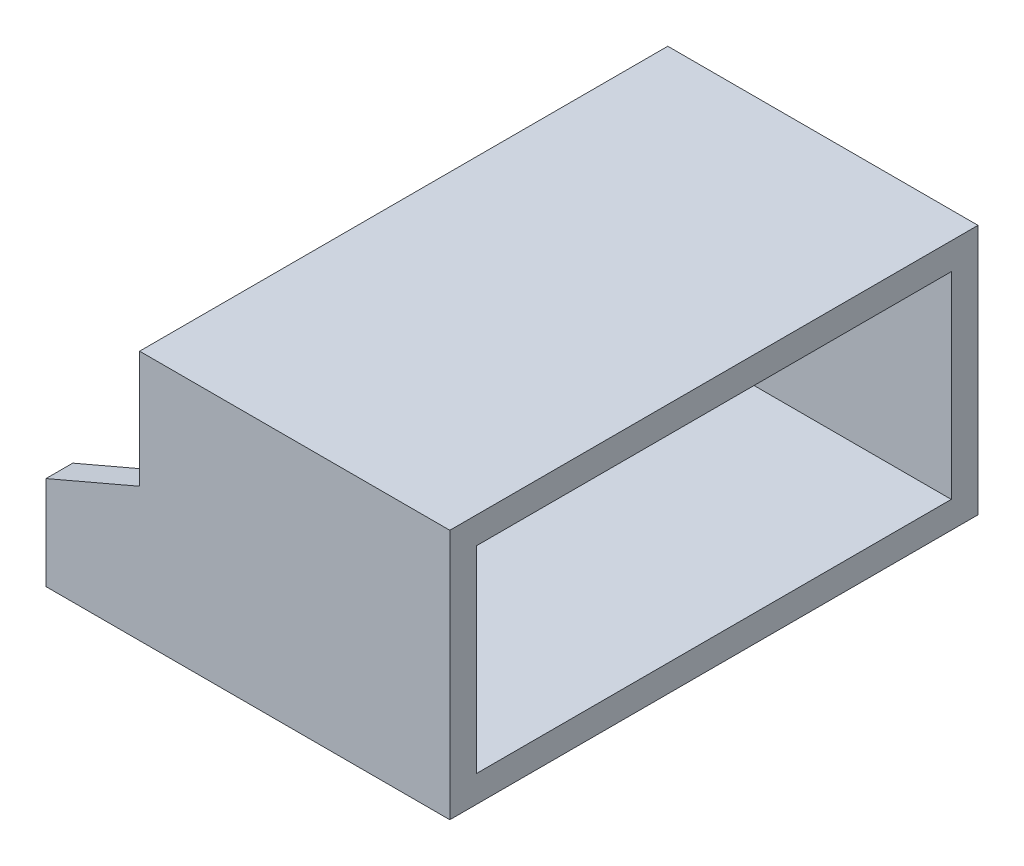
ISO-10303-21;
HEADER;
FILE_DESCRIPTION(('STEP AP214'),'2;1');
FILE_NAME('part.step','',(''),(''),'','','');
FILE_SCHEMA(('AUTOMOTIVE_DESIGN { 1 0 10303 214 1 1 1 1 }'));
ENDSEC;
DATA;
#1=APPLICATION_CONTEXT('core data for automotive mechanical design processes');
#2=APPLICATION_PROTOCOL_DEFINITION('international standard','automotive_design',2000,#1);
#3=PRODUCT_CONTEXT('',#1,'mechanical');
#4=PRODUCT('Part','Part','',(#3));
#5=PRODUCT_RELATED_PRODUCT_CATEGORY('part','',(#4));
#6=PRODUCT_DEFINITION_FORMATION('','',#4);
#7=PRODUCT_DEFINITION_CONTEXT('part definition',#1,'design');
#8=PRODUCT_DEFINITION('design','',#6,#7);
#9=PRODUCT_DEFINITION_SHAPE('','',#8);
#10=(LENGTH_UNIT() NAMED_UNIT(*) SI_UNIT(.MILLI.,.METRE.));
#11=(NAMED_UNIT(*) PLANE_ANGLE_UNIT() SI_UNIT($,.RADIAN.));
#12=(NAMED_UNIT(*) SI_UNIT($,.STERADIAN.) SOLID_ANGLE_UNIT());
#13=UNCERTAINTY_MEASURE_WITH_UNIT(LENGTH_MEASURE(1.E-05),#10,'distance_accuracy_value','');
#14=(GEOMETRIC_REPRESENTATION_CONTEXT(3) GLOBAL_UNCERTAINTY_ASSIGNED_CONTEXT((#13)) GLOBAL_UNIT_ASSIGNED_CONTEXT((#10,
#11,#12)) REPRESENTATION_CONTEXT('',''));
#15=CARTESIAN_POINT('',(0.,0.,0.));
#16=DIRECTION('',(0.,0.,1.));
#17=DIRECTION('',(1.,0.,0.));
#18=AXIS2_PLACEMENT_3D('',#15,#16,#17);
#19=CARTESIAN_POINT('',(5.8928,4.7625,0.));
#20=DIRECTION('',(-1.,0.,0.));
#21=DIRECTION('',(0.,0.,1.));
#22=AXIS2_PLACEMENT_3D('',#19,#20,#21);
#23=PLANE('',#22);
#24=DIRECTION('',(0.,0.,-1.));
#25=VECTOR('',#24,1.);
#26=CARTESIAN_POINT('',(5.8928,0.,0.));
#27=LINE('',#26,#25);
#28=CARTESIAN_POINT('',(5.8928,0.,0.));
#29=VERTEX_POINT('',#28);
#30=CARTESIAN_POINT('',(5.8928,0.,-10.033));
#31=VERTEX_POINT('',#30);
#32=EDGE_CURVE('E285',#29,#31,#27,.T.);
#33=ORIENTED_EDGE('',*,*,#32,.T.);
#34=DIRECTION('',(0.,-1.,0.));
#35=VECTOR('',#34,1.);
#36=CARTESIAN_POINT('',(5.8928,4.7625,-10.033));
#37=LINE('',#36,#35);
#38=CARTESIAN_POINT('',(5.8928,4.7625,-10.033));
#39=VERTEX_POINT('',#38);
#40=EDGE_CURVE('E292',#39,#31,#37,.T.);
#41=ORIENTED_EDGE('',*,*,#40,.F.);
#42=DIRECTION('',(0.,0.,-1.));
#43=VECTOR('',#42,1.);
#44=CARTESIAN_POINT('',(5.8928,4.7625,0.));
#45=LINE('',#44,#43);
#46=CARTESIAN_POINT('',(5.8928,4.7625,0.));
#47=VERTEX_POINT('',#46);
#48=EDGE_CURVE('E277',#47,#39,#45,.T.);
#49=ORIENTED_EDGE('',*,*,#48,.F.);
#50=DIRECTION('',(0.,-1.,0.));
#51=VECTOR('',#50,1.);
#52=CARTESIAN_POINT('',(5.8928,4.7625,0.));
#53=LINE('',#52,#51);
#54=EDGE_CURVE('E54',#47,#29,#53,.T.);
#55=ORIENTED_EDGE('',*,*,#54,.T.);
#56=EDGE_LOOP('',(#33,#41,#49,#55));
#57=FACE_BOUND('',#56,.T.);
#58=DIRECTION('',(0.,0.,-1.));
#59=VECTOR('',#58,1.);
#60=CARTESIAN_POINT('',(5.8928,0.508,0.));
#61=LINE('',#60,#59);
#62=CARTESIAN_POINT('',(5.8928,0.508,-0.508));
#63=VERTEX_POINT('',#62);
#64=CARTESIAN_POINT('',(5.8928,0.508,-9.525));
#65=VERTEX_POINT('',#64);
#66=EDGE_CURVE('E249',#63,#65,#61,.T.);
#67=ORIENTED_EDGE('',*,*,#66,.F.);
#68=DIRECTION('',(0.,-1.,0.));
#69=VECTOR('',#68,1.);
#70=CARTESIAN_POINT('',(5.8928,4.7625,-0.508));
#71=LINE('',#70,#69);
#72=CARTESIAN_POINT('',(5.8928,4.2545,-0.508));
#73=VERTEX_POINT('',#72);
#74=EDGE_CURVE('E234',#73,#63,#71,.T.);
#75=ORIENTED_EDGE('',*,*,#74,.F.);
#76=DIRECTION('',(0.,0.,-1.));
#77=VECTOR('',#76,1.);
#78=CARTESIAN_POINT('',(5.8928,4.2545,0.));
#79=LINE('',#78,#77);
#80=CARTESIAN_POINT('',(5.8928,4.2545,-9.525));
#81=VERTEX_POINT('',#80);
#82=EDGE_CURVE('E253',#73,#81,#79,.T.);
#83=ORIENTED_EDGE('',*,*,#82,.T.);
#84=DIRECTION('',(0.,-1.,0.));
#85=VECTOR('',#84,1.);
#86=CARTESIAN_POINT('',(5.8928,4.7625,-9.525));
#87=LINE('',#86,#85);
#88=EDGE_CURVE('E245',#81,#65,#87,.T.);
#89=ORIENTED_EDGE('',*,*,#88,.T.);
#90=EDGE_LOOP('',(#67,#75,#83,#89));
#91=FACE_BOUND('',#90,.T.);
#92=ADVANCED_FACE('F45',(#57,#91),#23,.F.);
#93=CARTESIAN_POINT('',(0.,4.7625,0.));
#94=DIRECTION('',(1.,0.,0.));
#95=DIRECTION('',(0.,0.,-1.));
#96=AXIS2_PLACEMENT_3D('',#93,#94,#95);
#97=PLANE('',#96);
#98=DIRECTION('',(0.,-1.,0.));
#99=VECTOR('',#98,1.);
#100=CARTESIAN_POINT('',(0.,4.7625,-10.033));
#101=LINE('',#100,#99);
#102=CARTESIAN_POINT('',(0.,4.7625,-10.033));
#103=VERTEX_POINT('',#102);
#104=CARTESIAN_POINT('',(0.,2.54,-10.033));
#105=VERTEX_POINT('',#104);
#106=EDGE_CURVE('E66',#103,#105,#101,.T.);
#107=ORIENTED_EDGE('',*,*,#106,.T.);
#108=DIRECTION('',(0.,0.,-1.));
#109=VECTOR('',#108,1.);
#110=CARTESIAN_POINT('',(0.,2.54,-9.525));
#111=LINE('',#110,#109);
#112=CARTESIAN_POINT('',(0.,2.54,-9.525));
#113=VERTEX_POINT('',#112);
#114=EDGE_CURVE('E61',#113,#105,#111,.T.);
#115=ORIENTED_EDGE('',*,*,#114,.F.);
#116=DIRECTION('',(0.,-1.,0.));
#117=VECTOR('',#116,1.);
#118=CARTESIAN_POINT('',(0.,0.,-9.525));
#119=LINE('',#118,#117);
#120=CARTESIAN_POINT('',(0.,0.,-9.525));
#121=VERTEX_POINT('',#120);
#122=EDGE_CURVE('E160',#113,#121,#119,.T.);
#123=ORIENTED_EDGE('',*,*,#122,.T.);
#124=DIRECTION('',(0.,0.,1.));
#125=VECTOR('',#124,1.);
#126=CARTESIAN_POINT('',(0.,0.,0.));
#127=LINE('',#126,#125);
#128=CARTESIAN_POINT('',(0.,0.,-0.508));
#129=VERTEX_POINT('',#128);
#130=EDGE_CURVE('E147',#121,#129,#127,.T.);
#131=ORIENTED_EDGE('',*,*,#130,.T.);
#132=DIRECTION('',(0.,1.,0.));
#133=VECTOR('',#132,1.);
#134=CARTESIAN_POINT('',(0.,0.,-0.508));
#135=LINE('',#134,#133);
#136=CARTESIAN_POINT('',(0.,2.54,-0.508));
#137=VERTEX_POINT('',#136);
#138=EDGE_CURVE('E195',#129,#137,#135,.T.);
#139=ORIENTED_EDGE('',*,*,#138,.T.);
#140=DIRECTION('',(0.,0.,1.));
#141=VECTOR('',#140,1.);
#142=CARTESIAN_POINT('',(0.,2.54,-0.508));
#143=LINE('',#142,#141);
#144=CARTESIAN_POINT('',(0.,2.54,0.));
#145=VERTEX_POINT('',#144);
#146=EDGE_CURVE('E209',#137,#145,#143,.T.);
#147=ORIENTED_EDGE('',*,*,#146,.T.);
#148=DIRECTION('',(0.,-1.,0.));
#149=VECTOR('',#148,1.);
#150=CARTESIAN_POINT('',(0.,4.7625,0.));
#151=LINE('',#150,#149);
#152=CARTESIAN_POINT('',(0.,4.7625,0.));
#153=VERTEX_POINT('',#152);
#154=EDGE_CURVE('E11',#153,#145,#151,.T.);
#155=ORIENTED_EDGE('',*,*,#154,.F.);
#156=DIRECTION('',(0.,0.,1.));
#157=VECTOR('',#156,1.);
#158=CARTESIAN_POINT('',(0.,4.7625,0.));
#159=LINE('',#158,#157);
#160=EDGE_CURVE('E269',#103,#153,#159,.T.);
#161=ORIENTED_EDGE('',*,*,#160,.F.);
#162=EDGE_LOOP('',(#107,#115,#123,#131,#139,#147,#155,#161));
#163=FACE_BOUND('',#162,.T.);
#164=ADVANCED_FACE('F47',(#163),#97,.F.);
#165=CARTESIAN_POINT('',(0.,4.7625,0.));
#166=DIRECTION('',(0.,0.,-1.));
#167=DIRECTION('',(-1.,0.,0.));
#168=AXIS2_PLACEMENT_3D('',#165,#166,#167);
#169=PLANE('',#168);
#170=DIRECTION('',(1.,0.,0.));
#171=VECTOR('',#170,1.);
#172=CARTESIAN_POINT('',(0.,0.,0.));
#173=LINE('',#172,#171);
#174=CARTESIAN_POINT('',(-1.778,0.,0.));
#175=VERTEX_POINT('',#174);
#176=EDGE_CURVE('E157',#175,#29,#173,.T.);
#177=ORIENTED_EDGE('',*,*,#176,.T.);
#178=ORIENTED_EDGE('',*,*,#54,.F.);
#179=DIRECTION('',(1.,0.,0.));
#180=VECTOR('',#179,1.);
#181=CARTESIAN_POINT('',(0.,4.7625,0.));
#182=LINE('',#181,#180);
#183=EDGE_CURVE('E273',#153,#47,#182,.T.);
#184=ORIENTED_EDGE('',*,*,#183,.F.);
#185=ORIENTED_EDGE('',*,*,#154,.T.);
#186=DIRECTION('',(-0.919145030018058,-0.393919298579168,0.));
#187=VECTOR('',#186,1.);
#188=CARTESIAN_POINT('',(-1.778,1.778,0.));
#189=LINE('',#188,#187);
#190=CARTESIAN_POINT('',(-1.778,1.778,0.));
#191=VERTEX_POINT('',#190);
#192=EDGE_CURVE('E189',#145,#191,#189,.T.);
#193=ORIENTED_EDGE('',*,*,#192,.T.);
#194=DIRECTION('',(0.,-1.,0.));
#195=VECTOR('',#194,1.);
#196=CARTESIAN_POINT('',(-1.778,0.,0.));
#197=LINE('',#196,#195);
#198=EDGE_CURVE('E199',#191,#175,#197,.T.);
#199=ORIENTED_EDGE('',*,*,#198,.T.);
#200=EDGE_LOOP('',(#177,#178,#184,#185,#193,#199));
#201=FACE_BOUND('',#200,.T.);
#202=ADVANCED_FACE('F312',(#201),#169,.F.);
#203=CARTESIAN_POINT('',(0.,4.7625,-10.033));
#204=DIRECTION('',(0.,0.,1.));
#205=DIRECTION('',(1.,0.,0.));
#206=AXIS2_PLACEMENT_3D('',#203,#204,#205);
#207=PLANE('',#206);
#208=DIRECTION('',(-1.,0.,0.));
#209=VECTOR('',#208,1.);
#210=CARTESIAN_POINT('',(0.,0.,-10.033));
#211=LINE('',#210,#209);
#212=CARTESIAN_POINT('',(-1.778,0.,-10.033));
#213=VERTEX_POINT('',#212);
#214=EDGE_CURVE('E274',#31,#213,#211,.T.);
#215=ORIENTED_EDGE('',*,*,#214,.T.);
#216=DIRECTION('',(0.,1.,0.));
#217=VECTOR('',#216,1.);
#218=CARTESIAN_POINT('',(-1.778,0.,-10.033));
#219=LINE('',#218,#217);
#220=CARTESIAN_POINT('',(-1.778,1.778,-10.033));
#221=VERTEX_POINT('',#220);
#222=EDGE_CURVE('E180',#213,#221,#219,.T.);
#223=ORIENTED_EDGE('',*,*,#222,.T.);
#224=DIRECTION('',(0.919145030018058,0.393919298579168,0.));
#225=VECTOR('',#224,1.);
#226=CARTESIAN_POINT('',(0.,2.54,-10.033));
#227=LINE('',#226,#225);
#228=EDGE_CURVE('E165',#221,#105,#227,.T.);
#229=ORIENTED_EDGE('',*,*,#228,.T.);
#230=ORIENTED_EDGE('',*,*,#106,.F.);
#231=DIRECTION('',(-1.,0.,0.));
#232=VECTOR('',#231,1.);
#233=CARTESIAN_POINT('',(0.,4.7625,-10.033));
#234=LINE('',#233,#232);
#235=EDGE_CURVE('E280',#39,#103,#234,.T.);
#236=ORIENTED_EDGE('',*,*,#235,.F.);
#237=ORIENTED_EDGE('',*,*,#40,.T.);
#238=EDGE_LOOP('',(#215,#223,#229,#230,#236,#237));
#239=FACE_BOUND('',#238,.T.);
#240=ADVANCED_FACE('F307',(#239),#207,.F.);
#241=CARTESIAN_POINT('',(0.,4.7625,0.));
#242=DIRECTION('',(0.,-1.,0.));
#243=DIRECTION('',(0.,0.,-1.));
#244=AXIS2_PLACEMENT_3D('',#241,#242,#243);
#245=PLANE('',#244);
#246=ORIENTED_EDGE('',*,*,#160,.T.);
#247=ORIENTED_EDGE('',*,*,#183,.T.);
#248=ORIENTED_EDGE('',*,*,#48,.T.);
#249=ORIENTED_EDGE('',*,*,#235,.T.);
#250=EDGE_LOOP('',(#246,#247,#248,#249));
#251=FACE_BOUND('',#250,.T.);
#252=ADVANCED_FACE('F310',(#251),#245,.F.);
#253=CARTESIAN_POINT('',(0.,0.,0.));
#254=DIRECTION('',(0.,-1.,0.));
#255=DIRECTION('',(0.,0.,-1.));
#256=AXIS2_PLACEMENT_3D('',#253,#254,#255);
#257=PLANE('',#256);
#258=ORIENTED_EDGE('',*,*,#130,.F.);
#259=DIRECTION('',(-1.,0.,0.));
#260=VECTOR('',#259,1.);
#261=CARTESIAN_POINT('',(0.,0.,-9.525));
#262=LINE('',#261,#260);
#263=CARTESIAN_POINT('',(-1.778,0.,-9.525));
#264=VERTEX_POINT('',#263);
#265=EDGE_CURVE('E151',#121,#264,#262,.T.);
#266=ORIENTED_EDGE('',*,*,#265,.T.);
#267=DIRECTION('',(0.,0.,-1.));
#268=VECTOR('',#267,1.);
#269=CARTESIAN_POINT('',(-1.778,0.,-9.525));
#270=LINE('',#269,#268);
#271=EDGE_CURVE('E179',#264,#213,#270,.T.);
#272=ORIENTED_EDGE('',*,*,#271,.T.);
#273=ORIENTED_EDGE('',*,*,#214,.F.);
#274=ORIENTED_EDGE('',*,*,#32,.F.);
#275=ORIENTED_EDGE('',*,*,#176,.F.);
#276=DIRECTION('',(0.,0.,1.));
#277=VECTOR('',#276,1.);
#278=CARTESIAN_POINT('',(-1.778,0.,-0.508));
#279=LINE('',#278,#277);
#280=CARTESIAN_POINT('',(-1.778,0.,-0.508));
#281=VERTEX_POINT('',#280);
#282=EDGE_CURVE('E216',#281,#175,#279,.T.);
#283=ORIENTED_EDGE('',*,*,#282,.F.);
#284=DIRECTION('',(1.,0.,0.));
#285=VECTOR('',#284,1.);
#286=CARTESIAN_POINT('',(0.,0.,-0.508));
#287=LINE('',#286,#285);
#288=EDGE_CURVE('E153',#281,#129,#287,.T.);
#289=ORIENTED_EDGE('',*,*,#288,.T.);
#290=EDGE_LOOP('',(#258,#266,#272,#273,#274,#275,#283,#289));
#291=FACE_BOUND('',#290,.T.);
#292=ADVANCED_FACE('F148',(#291),#257,.T.);
#293=CARTESIAN_POINT('',(0.508,4.7625,0.));
#294=DIRECTION('',(1.,0.,0.));
#295=DIRECTION('',(0.,0.,-1.));
#296=AXIS2_PLACEMENT_3D('',#293,#294,#295);
#297=PLANE('',#296);
#298=DIRECTION('',(0.,0.,1.));
#299=VECTOR('',#298,1.);
#300=CARTESIAN_POINT('',(0.508,0.508,0.));
#301=LINE('',#300,#299);
#302=CARTESIAN_POINT('',(0.508,0.508,-9.525));
#303=VERTEX_POINT('',#302);
#304=CARTESIAN_POINT('',(0.508,0.508,-0.508));
#305=VERTEX_POINT('',#304);
#306=EDGE_CURVE('E220',#303,#305,#301,.T.);
#307=ORIENTED_EDGE('',*,*,#306,.F.);
#308=DIRECTION('',(0.,-1.,0.));
#309=VECTOR('',#308,1.);
#310=CARTESIAN_POINT('',(0.508,4.7625,-9.525));
#311=LINE('',#310,#309);
#312=CARTESIAN_POINT('',(0.508,4.2545,-9.525));
#313=VERTEX_POINT('',#312);
#314=EDGE_CURVE('E241',#313,#303,#311,.T.);
#315=ORIENTED_EDGE('',*,*,#314,.F.);
#316=DIRECTION('',(0.,0.,1.));
#317=VECTOR('',#316,1.);
#318=CARTESIAN_POINT('',(0.508,4.2545,0.));
#319=LINE('',#318,#317);
#320=CARTESIAN_POINT('',(0.508,4.2545,-0.508));
#321=VERTEX_POINT('',#320);
#322=EDGE_CURVE('E235',#313,#321,#319,.T.);
#323=ORIENTED_EDGE('',*,*,#322,.T.);
#324=DIRECTION('',(0.,-1.,0.));
#325=VECTOR('',#324,1.);
#326=CARTESIAN_POINT('',(0.508,4.7625,-0.508));
#327=LINE('',#326,#325);
#328=EDGE_CURVE('E158',#321,#305,#327,.T.);
#329=ORIENTED_EDGE('',*,*,#328,.T.);
#330=EDGE_LOOP('',(#307,#315,#323,#329));
#331=FACE_BOUND('',#330,.T.);
#332=ADVANCED_FACE('F352',(#331),#297,.T.);
#333=CARTESIAN_POINT('',(0.,4.7625,-0.508));
#334=DIRECTION('',(0.,0.,-1.));
#335=DIRECTION('',(-1.,0.,0.));
#336=AXIS2_PLACEMENT_3D('',#333,#334,#335);
#337=PLANE('',#336);
#338=DIRECTION('',(1.,0.,0.));
#339=VECTOR('',#338,1.);
#340=CARTESIAN_POINT('',(0.,0.508,-0.508));
#341=LINE('',#340,#339);
#342=EDGE_CURVE('E230',#305,#63,#341,.T.);
#343=ORIENTED_EDGE('',*,*,#342,.F.);
#344=ORIENTED_EDGE('',*,*,#328,.F.);
#345=DIRECTION('',(1.,0.,0.));
#346=VECTOR('',#345,1.);
#347=CARTESIAN_POINT('',(0.,4.2545,-0.508));
#348=LINE('',#347,#346);
#349=EDGE_CURVE('E239',#321,#73,#348,.T.);
#350=ORIENTED_EDGE('',*,*,#349,.T.);
#351=ORIENTED_EDGE('',*,*,#74,.T.);
#352=EDGE_LOOP('',(#343,#344,#350,#351));
#353=FACE_BOUND('',#352,.T.);
#354=ADVANCED_FACE('F360',(#353),#337,.T.);
#355=CARTESIAN_POINT('',(0.,4.7625,-9.525));
#356=DIRECTION('',(0.,0.,1.));
#357=DIRECTION('',(1.,0.,0.));
#358=AXIS2_PLACEMENT_3D('',#355,#356,#357);
#359=PLANE('',#358);
#360=DIRECTION('',(-1.,0.,0.));
#361=VECTOR('',#360,1.);
#362=CARTESIAN_POINT('',(0.,0.508,-9.525));
#363=LINE('',#362,#361);
#364=EDGE_CURVE('E240',#65,#303,#363,.T.);
#365=ORIENTED_EDGE('',*,*,#364,.F.);
#366=ORIENTED_EDGE('',*,*,#88,.F.);
#367=DIRECTION('',(-1.,0.,0.));
#368=VECTOR('',#367,1.);
#369=CARTESIAN_POINT('',(0.,4.2545,-9.525));
#370=LINE('',#369,#368);
#371=EDGE_CURVE('E246',#81,#313,#370,.T.);
#372=ORIENTED_EDGE('',*,*,#371,.T.);
#373=ORIENTED_EDGE('',*,*,#314,.T.);
#374=EDGE_LOOP('',(#365,#366,#372,#373));
#375=FACE_BOUND('',#374,.T.);
#376=ADVANCED_FACE('F356',(#375),#359,.T.);
#377=CARTESIAN_POINT('',(0.,4.2545,0.));
#378=DIRECTION('',(0.,-1.,0.));
#379=DIRECTION('',(0.,0.,-1.));
#380=AXIS2_PLACEMENT_3D('',#377,#378,#379);
#381=PLANE('',#380);
#382=ORIENTED_EDGE('',*,*,#322,.F.);
#383=ORIENTED_EDGE('',*,*,#371,.F.);
#384=ORIENTED_EDGE('',*,*,#82,.F.);
#385=ORIENTED_EDGE('',*,*,#349,.F.);
#386=EDGE_LOOP('',(#382,#383,#384,#385));
#387=FACE_BOUND('',#386,.T.);
#388=ADVANCED_FACE('F330',(#387),#381,.T.);
#389=CARTESIAN_POINT('',(0.,0.508,0.));
#390=DIRECTION('',(0.,-1.,0.));
#391=DIRECTION('',(0.,0.,-1.));
#392=AXIS2_PLACEMENT_3D('',#389,#390,#391);
#393=PLANE('',#392);
#394=ORIENTED_EDGE('',*,*,#306,.T.);
#395=ORIENTED_EDGE('',*,*,#342,.T.);
#396=ORIENTED_EDGE('',*,*,#66,.T.);
#397=ORIENTED_EDGE('',*,*,#364,.T.);
#398=EDGE_LOOP('',(#394,#395,#396,#397));
#399=FACE_BOUND('',#398,.T.);
#400=ADVANCED_FACE('F323',(#399),#393,.F.);
#401=CARTESIAN_POINT('',(-1.778,0.,-0.508));
#402=DIRECTION('',(-1.,0.,0.));
#403=DIRECTION('',(0.,0.,1.));
#404=AXIS2_PLACEMENT_3D('',#401,#402,#403);
#405=PLANE('',#404);
#406=ORIENTED_EDGE('',*,*,#198,.F.);
#407=DIRECTION('',(0.,0.,1.));
#408=VECTOR('',#407,1.);
#409=CARTESIAN_POINT('',(-1.778,1.778,-0.508));
#410=LINE('',#409,#408);
#411=CARTESIAN_POINT('',(-1.778,1.778,-0.508));
#412=VERTEX_POINT('',#411);
#413=EDGE_CURVE('E221',#412,#191,#410,.T.);
#414=ORIENTED_EDGE('',*,*,#413,.F.);
#415=DIRECTION('',(0.,-1.,0.));
#416=VECTOR('',#415,1.);
#417=CARTESIAN_POINT('',(-1.778,0.,-0.508));
#418=LINE('',#417,#416);
#419=EDGE_CURVE('E203',#412,#281,#418,.T.);
#420=ORIENTED_EDGE('',*,*,#419,.T.);
#421=ORIENTED_EDGE('',*,*,#282,.T.);
#422=EDGE_LOOP('',(#406,#414,#420,#421));
#423=FACE_BOUND('',#422,.T.);
#424=ADVANCED_FACE('F321',(#423),#405,.T.);
#425=CARTESIAN_POINT('',(-1.778,1.778,-0.508));
#426=DIRECTION('',(-0.393919298579168,0.919145030018058,0.));
#427=DIRECTION('',(-0.919145030018058,-0.393919298579168,0.));
#428=AXIS2_PLACEMENT_3D('',#425,#426,#427);
#429=PLANE('',#428);
#430=ORIENTED_EDGE('',*,*,#192,.F.);
#431=ORIENTED_EDGE('',*,*,#146,.F.);
#432=DIRECTION('',(-0.919145030018058,-0.393919298579168,0.));
#433=VECTOR('',#432,1.);
#434=CARTESIAN_POINT('',(-1.778,1.778,-0.508));
#435=LINE('',#434,#433);
#436=EDGE_CURVE('E198',#137,#412,#435,.T.);
#437=ORIENTED_EDGE('',*,*,#436,.T.);
#438=ORIENTED_EDGE('',*,*,#413,.T.);
#439=EDGE_LOOP('',(#430,#431,#437,#438));
#440=FACE_BOUND('',#439,.T.);
#441=ADVANCED_FACE('F315',(#440),#429,.T.);
#442=CARTESIAN_POINT('',(0.,0.,-0.508));
#443=DIRECTION('',(0.,0.,1.));
#444=DIRECTION('',(1.,0.,0.));
#445=AXIS2_PLACEMENT_3D('',#442,#443,#444);
#446=PLANE('',#445);
#447=ORIENTED_EDGE('',*,*,#138,.F.);
#448=ORIENTED_EDGE('',*,*,#288,.F.);
#449=ORIENTED_EDGE('',*,*,#419,.F.);
#450=ORIENTED_EDGE('',*,*,#436,.F.);
#451=EDGE_LOOP('',(#447,#448,#449,#450));
#452=FACE_BOUND('',#451,.T.);
#453=ADVANCED_FACE('F318',(#452),#446,.F.);
#454=CARTESIAN_POINT('',(0.,2.54,-9.525));
#455=DIRECTION('',(-0.393919298579168,0.919145030018058,0.));
#456=DIRECTION('',(-0.919145030018058,-0.393919298579168,0.));
#457=AXIS2_PLACEMENT_3D('',#454,#455,#456);
#458=PLANE('',#457);
#459=ORIENTED_EDGE('',*,*,#228,.F.);
#460=DIRECTION('',(0.,0.,-1.));
#461=VECTOR('',#460,1.);
#462=CARTESIAN_POINT('',(-1.778,1.778,-9.525));
#463=LINE('',#462,#461);
#464=CARTESIAN_POINT('',(-1.778,1.778,-9.525));
#465=VERTEX_POINT('',#464);
#466=EDGE_CURVE('E190',#465,#221,#463,.T.);
#467=ORIENTED_EDGE('',*,*,#466,.F.);
#468=DIRECTION('',(0.919145030018058,0.393919298579168,0.));
#469=VECTOR('',#468,1.);
#470=CARTESIAN_POINT('',(0.,2.54,-9.525));
#471=LINE('',#470,#469);
#472=EDGE_CURVE('E174',#465,#113,#471,.T.);
#473=ORIENTED_EDGE('',*,*,#472,.T.);
#474=ORIENTED_EDGE('',*,*,#114,.T.);
#475=EDGE_LOOP('',(#459,#467,#473,#474));
#476=FACE_BOUND('',#475,.T.);
#477=ADVANCED_FACE('F426',(#476),#458,.T.);
#478=CARTESIAN_POINT('',(-1.778,0.,-9.525));
#479=DIRECTION('',(-1.,0.,0.));
#480=DIRECTION('',(0.,0.,1.));
#481=AXIS2_PLACEMENT_3D('',#478,#479,#480);
#482=PLANE('',#481);
#483=ORIENTED_EDGE('',*,*,#222,.F.);
#484=ORIENTED_EDGE('',*,*,#271,.F.);
#485=DIRECTION('',(0.,1.,0.));
#486=VECTOR('',#485,1.);
#487=CARTESIAN_POINT('',(-1.778,0.,-9.525));
#488=LINE('',#487,#486);
#489=EDGE_CURVE('E170',#264,#465,#488,.T.);
#490=ORIENTED_EDGE('',*,*,#489,.T.);
#491=ORIENTED_EDGE('',*,*,#466,.T.);
#492=EDGE_LOOP('',(#483,#484,#490,#491));
#493=FACE_BOUND('',#492,.T.);
#494=ADVANCED_FACE('F455',(#493),#482,.T.);
#495=CARTESIAN_POINT('',(0.,0.,-9.525));
#496=DIRECTION('',(0.,0.,1.));
#497=DIRECTION('',(1.,0.,0.));
#498=AXIS2_PLACEMENT_3D('',#495,#496,#497);
#499=PLANE('',#498);
#500=ORIENTED_EDGE('',*,*,#122,.F.);
#501=ORIENTED_EDGE('',*,*,#472,.F.);
#502=ORIENTED_EDGE('',*,*,#489,.F.);
#503=ORIENTED_EDGE('',*,*,#265,.F.);
#504=EDGE_LOOP('',(#500,#501,#502,#503));
#505=FACE_BOUND('',#504,.T.);
#506=ADVANCED_FACE('F168',(#505),#499,.T.);
#507=CLOSED_SHELL('',(#92,#164,#202,#240,#252,#292,#332,#354,#376,#388,#400,#424,#441,#453,#477,
#494,#506));
#508=MANIFOLD_SOLID_BREP('B2',#507);
#509=ADVANCED_BREP_SHAPE_REPRESENTATION('',(#18,#508),#14);
#510=SHAPE_DEFINITION_REPRESENTATION(#9,#509);
ENDSEC;
END-ISO-10303-21;
